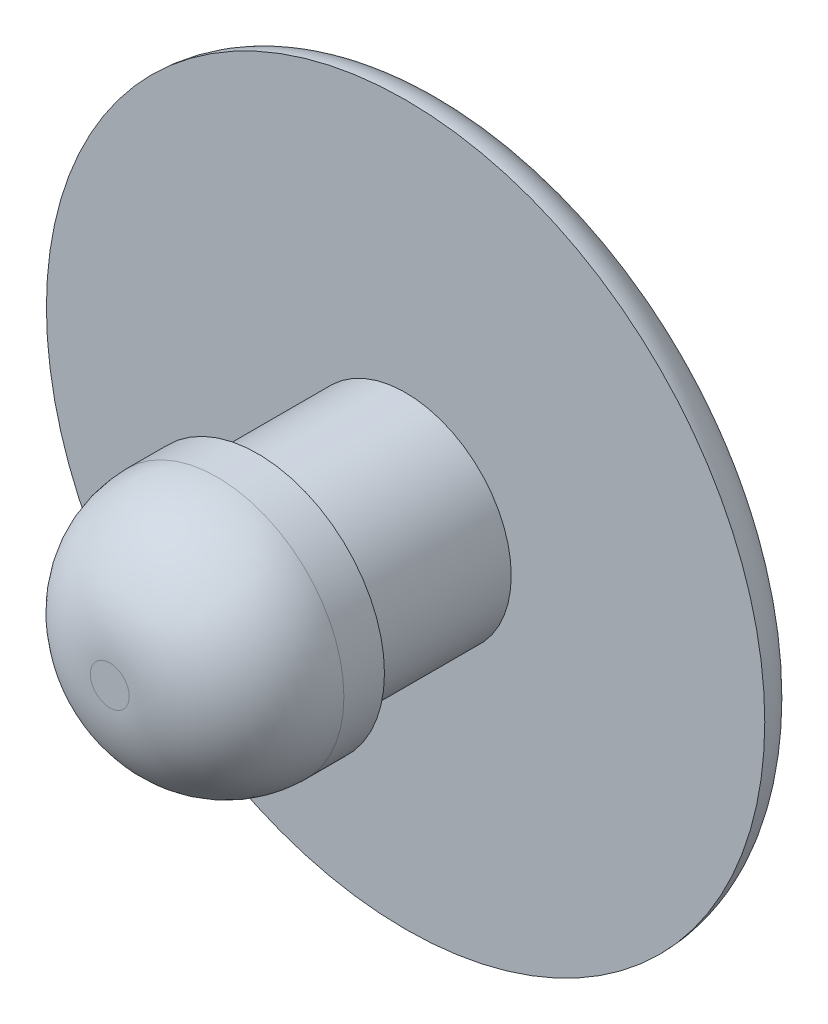
ISO-10303-21;
HEADER;
FILE_DESCRIPTION(('STEP AP214'),'2;1');
FILE_NAME('part.step','',(''),(''),'','','');
FILE_SCHEMA(('AUTOMOTIVE_DESIGN { 1 0 10303 214 1 1 1 1 }'));
ENDSEC;
DATA;
#1=APPLICATION_CONTEXT('core data for automotive mechanical design processes');
#2=APPLICATION_PROTOCOL_DEFINITION('international standard','automotive_design',2000,#1);
#3=PRODUCT_CONTEXT('',#1,'mechanical');
#4=PRODUCT('Part','Part','',(#3));
#5=PRODUCT_RELATED_PRODUCT_CATEGORY('part','',(#4));
#6=PRODUCT_DEFINITION_FORMATION('','',#4);
#7=PRODUCT_DEFINITION_CONTEXT('part definition',#1,'design');
#8=PRODUCT_DEFINITION('design','',#6,#7);
#9=PRODUCT_DEFINITION_SHAPE('','',#8);
#10=(LENGTH_UNIT() NAMED_UNIT(*) SI_UNIT(.MILLI.,.METRE.));
#11=(NAMED_UNIT(*) PLANE_ANGLE_UNIT() SI_UNIT($,.RADIAN.));
#12=(NAMED_UNIT(*) SI_UNIT($,.STERADIAN.) SOLID_ANGLE_UNIT());
#13=UNCERTAINTY_MEASURE_WITH_UNIT(LENGTH_MEASURE(1.E-05),#10,'distance_accuracy_value','');
#14=(GEOMETRIC_REPRESENTATION_CONTEXT(3) GLOBAL_UNCERTAINTY_ASSIGNED_CONTEXT((#13)) GLOBAL_UNIT_ASSIGNED_CONTEXT((#10,
#11,#12)) REPRESENTATION_CONTEXT('',''));
#15=CARTESIAN_POINT('',(0.,0.,0.));
#16=DIRECTION('',(0.,0.,1.));
#17=DIRECTION('',(1.,0.,0.));
#18=AXIS2_PLACEMENT_3D('',#15,#16,#17);
#19=CARTESIAN_POINT('',(0.,0.,0.5));
#20=DIRECTION('',(0.,0.,1.));
#21=DIRECTION('',(1.,0.,0.));
#22=AXIS2_PLACEMENT_3D('',#19,#20,#21);
#23=PLANE('',#22);
#24=CARTESIAN_POINT('',(0.,0.,0.5));
#25=DIRECTION('',(0.,0.,1.));
#26=DIRECTION('',(1.,0.,0.));
#27=AXIS2_PLACEMENT_3D('',#24,#25,#26);
#28=CIRCLE('',#27,4.25);
#29=CARTESIAN_POINT('',(4.25,0.,0.5));
#30=VERTEX_POINT('',#29);
#31=EDGE_CURVE('E46',#30,#30,#28,.T.);
#32=ORIENTED_EDGE('',*,*,#31,.T.);
#33=EDGE_LOOP('',(#32));
#34=FACE_BOUND('',#33,.T.);
#35=CARTESIAN_POINT('',(0.,0.,0.5));
#36=DIRECTION('',(0.,0.,1.));
#37=DIRECTION('',(1.,0.,0.));
#38=AXIS2_PLACEMENT_3D('',#35,#36,#37);
#39=CIRCLE('',#38,1.25);
#40=CARTESIAN_POINT('',(1.25,0.,0.5));
#41=VERTEX_POINT('',#40);
#42=EDGE_CURVE('E52',#41,#41,#39,.T.);
#43=ORIENTED_EDGE('',*,*,#42,.F.);
#44=EDGE_LOOP('',(#43));
#45=FACE_BOUND('',#44,.T.);
#46=ADVANCED_FACE('F31',(#34,#45),#23,.T.);
#47=CARTESIAN_POINT('',(0.,0.,0.));
#48=DIRECTION('',(0.,0.,1.));
#49=DIRECTION('',(1.,0.,0.));
#50=AXIS2_PLACEMENT_3D('',#47,#48,#49);
#51=PLANE('',#50);
#52=CARTESIAN_POINT('',(0.,0.,0.));
#53=DIRECTION('',(0.,0.,1.));
#54=DIRECTION('',(1.,0.,0.));
#55=AXIS2_PLACEMENT_3D('',#52,#53,#54);
#56=CIRCLE('',#55,3.74206299603199);
#57=CARTESIAN_POINT('',(3.74206299603199,0.,0.));
#58=VERTEX_POINT('',#57);
#59=EDGE_CURVE('E42',#58,#58,#56,.F.);
#60=ORIENTED_EDGE('',*,*,#59,.T.);
#61=EDGE_LOOP('',(#60));
#62=FACE_BOUND('',#61,.T.);
#63=ADVANCED_FACE('F77',(#62),#51,.F.);
#64=CARTESIAN_POINT('',(0.,0.,0.508));
#65=DIRECTION('',(0.,0.,-1.));
#66=DIRECTION('',(-1.,0.,0.));
#67=AXIS2_PLACEMENT_3D('',#64,#65,#66);
#68=TOROIDAL_SURFACE('',#67,3.74206299603199,0.508);
#69=ORIENTED_EDGE('',*,*,#59,.F.);
#70=EDGE_LOOP('',(#69));
#71=FACE_BOUND('',#70,.T.);
#72=ORIENTED_EDGE('',*,*,#31,.F.);
#73=EDGE_LOOP('',(#72));
#74=FACE_BOUND('',#73,.T.);
#75=ADVANCED_FACE('F72',(#71,#74),#68,.T.);
#76=CARTESIAN_POINT('',(0.,0.,2.25));
#77=DIRECTION('',(0.,0.,-1.));
#78=DIRECTION('',(-1.,0.,0.));
#79=AXIS2_PLACEMENT_3D('',#76,#77,#78);
#80=CYLINDRICAL_SURFACE('',#79,1.25);
#81=CARTESIAN_POINT('',(0.,0.,2.25));
#82=DIRECTION('',(0.,0.,1.));
#83=DIRECTION('',(1.,0.,0.));
#84=AXIS2_PLACEMENT_3D('',#81,#82,#83);
#85=CIRCLE('',#84,1.25);
#86=CARTESIAN_POINT('',(1.25,0.,2.25));
#87=VERTEX_POINT('',#86);
#88=EDGE_CURVE('E51',#87,#87,#85,.T.);
#89=ORIENTED_EDGE('',*,*,#88,.F.);
#90=EDGE_LOOP('',(#89));
#91=FACE_BOUND('',#90,.T.);
#92=ORIENTED_EDGE('',*,*,#42,.T.);
#93=EDGE_LOOP('',(#92));
#94=FACE_BOUND('',#93,.T.);
#95=ADVANCED_FACE('F66',(#91,#94),#80,.T.);
#96=CARTESIAN_POINT('',(0.,0.,2.25));
#97=DIRECTION('',(0.,0.,1.));
#98=DIRECTION('',(1.,0.,0.));
#99=AXIS2_PLACEMENT_3D('',#96,#97,#98);
#100=PLANE('',#99);
#101=CARTESIAN_POINT('',(0.,0.,2.25));
#102=DIRECTION('',(0.,0.,1.));
#103=DIRECTION('',(1.,0.,0.));
#104=AXIS2_PLACEMENT_3D('',#101,#102,#103);
#105=CIRCLE('',#104,1.5);
#106=CARTESIAN_POINT('',(1.5,0.,2.25));
#107=VERTEX_POINT('',#106);
#108=EDGE_CURVE('E55',#107,#107,#105,.T.);
#109=ORIENTED_EDGE('',*,*,#108,.F.);
#110=EDGE_LOOP('',(#109));
#111=FACE_BOUND('',#110,.T.);
#112=ORIENTED_EDGE('',*,*,#88,.T.);
#113=EDGE_LOOP('',(#112));
#114=FACE_BOUND('',#113,.T.);
#115=ADVANCED_FACE('F63',(#111,#114),#100,.F.);
#116=CARTESIAN_POINT('',(0.,0.,4.));
#117=DIRECTION('',(0.,0.,-1.));
#118=DIRECTION('',(-1.,0.,0.));
#119=AXIS2_PLACEMENT_3D('',#116,#117,#118);
#120=CYLINDRICAL_SURFACE('',#119,1.5);
#121=CARTESIAN_POINT('',(0.,0.,2.73));
#122=DIRECTION('',(0.,0.,1.));
#123=DIRECTION('',(1.,0.,0.));
#124=AXIS2_PLACEMENT_3D('',#121,#122,#123);
#125=CIRCLE('',#124,1.5);
#126=CARTESIAN_POINT('',(1.5,0.,2.73));
#127=VERTEX_POINT('',#126);
#128=EDGE_CURVE('E10',#127,#127,#125,.F.);
#129=ORIENTED_EDGE('',*,*,#128,.T.);
#130=EDGE_LOOP('',(#129));
#131=FACE_BOUND('',#130,.T.);
#132=ORIENTED_EDGE('',*,*,#108,.T.);
#133=EDGE_LOOP('',(#132));
#134=FACE_BOUND('',#133,.T.);
#135=ADVANCED_FACE('F61',(#131,#134),#120,.T.);
#136=CARTESIAN_POINT('',(0.,0.,4.));
#137=DIRECTION('',(0.,0.,1.));
#138=DIRECTION('',(1.,0.,0.));
#139=AXIS2_PLACEMENT_3D('',#136,#137,#138);
#140=PLANE('',#139);
#141=CARTESIAN_POINT('',(0.,0.,4.));
#142=DIRECTION('',(0.,0.,1.));
#143=DIRECTION('',(1.,0.,0.));
#144=AXIS2_PLACEMENT_3D('',#141,#142,#143);
#145=CIRCLE('',#144,0.23);
#146=CARTESIAN_POINT('',(0.23,0.,4.));
#147=VERTEX_POINT('',#146);
#148=EDGE_CURVE('E38',#147,#147,#145,.T.);
#149=ORIENTED_EDGE('',*,*,#148,.T.);
#150=EDGE_LOOP('',(#149));
#151=FACE_BOUND('',#150,.T.);
#152=ADVANCED_FACE('F109',(#151),#140,.T.);
#153=CARTESIAN_POINT('',(0.,0.,2.73));
#154=DIRECTION('',(0.,0.,1.));
#155=DIRECTION('',(1.,0.,0.));
#156=AXIS2_PLACEMENT_3D('',#153,#154,#155);
#157=DEGENERATE_TOROIDAL_SURFACE('',#156,0.23,1.27,.T.);
#158=ORIENTED_EDGE('',*,*,#128,.F.);
#159=EDGE_LOOP('',(#158));
#160=FACE_BOUND('',#159,.T.);
#161=ORIENTED_EDGE('',*,*,#148,.F.);
#162=EDGE_LOOP('',(#161));
#163=FACE_BOUND('',#162,.T.);
#164=ADVANCED_FACE('F33',(#160,#163),#157,.T.);
#165=CLOSED_SHELL('',(#46,#63,#75,#95,#115,#135,#152,#164));
#166=MANIFOLD_SOLID_BREP('B2',#165);
#167=ADVANCED_BREP_SHAPE_REPRESENTATION('',(#18,#166),#14);
#168=SHAPE_DEFINITION_REPRESENTATION(#9,#167);
ENDSEC;
END-ISO-10303-21;
